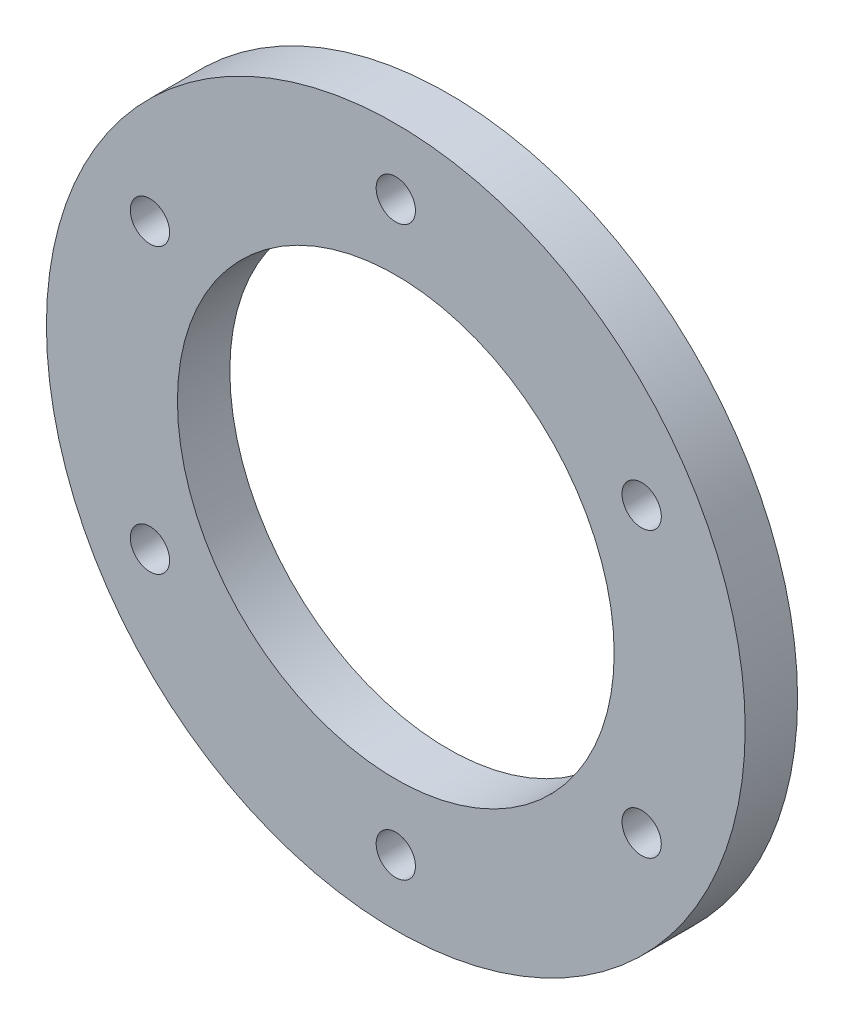
ISO-10303-21;
HEADER;
FILE_DESCRIPTION(('STEP AP214'),'2;1');
FILE_NAME('part.step','',(''),(''),'','','');
FILE_SCHEMA(('AUTOMOTIVE_DESIGN { 1 0 10303 214 1 1 1 1 }'));
ENDSEC;
DATA;
#1=APPLICATION_CONTEXT('core data for automotive mechanical design processes');
#2=APPLICATION_PROTOCOL_DEFINITION('international standard','automotive_design',2000,#1);
#3=PRODUCT_CONTEXT('',#1,'mechanical');
#4=PRODUCT('Part','Part','',(#3));
#5=PRODUCT_RELATED_PRODUCT_CATEGORY('part','',(#4));
#6=PRODUCT_DEFINITION_FORMATION('','',#4);
#7=PRODUCT_DEFINITION_CONTEXT('part definition',#1,'design');
#8=PRODUCT_DEFINITION('design','',#6,#7);
#9=PRODUCT_DEFINITION_SHAPE('','',#8);
#10=(LENGTH_UNIT() NAMED_UNIT(*) SI_UNIT(.MILLI.,.METRE.));
#11=(NAMED_UNIT(*) PLANE_ANGLE_UNIT() SI_UNIT($,.RADIAN.));
#12=(NAMED_UNIT(*) SI_UNIT($,.STERADIAN.) SOLID_ANGLE_UNIT());
#13=UNCERTAINTY_MEASURE_WITH_UNIT(LENGTH_MEASURE(1.E-05),#10,'distance_accuracy_value','');
#14=(GEOMETRIC_REPRESENTATION_CONTEXT(3) GLOBAL_UNCERTAINTY_ASSIGNED_CONTEXT((#13)) GLOBAL_UNIT_ASSIGNED_CONTEXT((#10,
#11,#12)) REPRESENTATION_CONTEXT('',''));
#15=CARTESIAN_POINT('',(0.,0.,0.));
#16=DIRECTION('',(0.,0.,1.));
#17=DIRECTION('',(1.,0.,0.));
#18=AXIS2_PLACEMENT_3D('',#15,#16,#17);
#19=CARTESIAN_POINT('',(0.,0.,6.));
#20=DIRECTION('',(0.,0.,1.));
#21=DIRECTION('',(1.,0.,0.));
#22=AXIS2_PLACEMENT_3D('',#19,#20,#21);
#23=PLANE('',#22);
#24=CARTESIAN_POINT('',(28.1458256229941,16.2500000000003,6.));
#25=DIRECTION('',(0.,0.,1.));
#26=DIRECTION('',(0.50000000000001,-0.866025403784433,0.));
#27=AXIS2_PLACEMENT_3D('',#24,#25,#26);
#28=CIRCLE('',#27,2.25);
#29=CARTESIAN_POINT('',(29.2708256229941,14.3014428414854,6.));
#30=VERTEX_POINT('',#29);
#31=EDGE_CURVE('E80',#30,#30,#28,.T.);
#32=ORIENTED_EDGE('',*,*,#31,.F.);
#33=EDGE_LOOP('',(#32));
#34=FACE_BOUND('',#33,.T.);
#35=CARTESIAN_POINT('',(28.1458256229944,-16.2499999999997,6.));
#36=DIRECTION('',(0.,0.,1.));
#37=DIRECTION('',(-0.499999999999992,-0.866025403784443,0.));
#38=AXIS2_PLACEMENT_3D('',#35,#36,#37);
#39=CIRCLE('',#38,2.25);
#40=CARTESIAN_POINT('',(27.0208256229944,-18.1985571585147,6.));
#41=VERTEX_POINT('',#40);
#42=EDGE_CURVE('E88',#41,#41,#39,.T.);
#43=ORIENTED_EDGE('',*,*,#42,.F.);
#44=EDGE_LOOP('',(#43));
#45=FACE_BOUND('',#44,.T.);
#46=CARTESIAN_POINT('',(0.,-32.5,6.));
#47=DIRECTION('',(0.,0.,1.));
#48=DIRECTION('',(-1.,0.,0.));
#49=AXIS2_PLACEMENT_3D('',#46,#47,#48);
#50=CIRCLE('',#49,2.25);
#51=CARTESIAN_POINT('',(-2.25,-32.5,6.));
#52=VERTEX_POINT('',#51);
#53=EDGE_CURVE('E96',#52,#52,#50,.T.);
#54=ORIENTED_EDGE('',*,*,#53,.F.);
#55=EDGE_LOOP('',(#54));
#56=FACE_BOUND('',#55,.T.);
#57=CARTESIAN_POINT('',(-28.1458256229942,-16.2500000000001,6.));
#58=DIRECTION('',(0.,0.,1.));
#59=DIRECTION('',(-0.500000000000004,0.866025403784436,0.));
#60=AXIS2_PLACEMENT_3D('',#57,#58,#59);
#61=CIRCLE('',#60,2.25);
#62=CARTESIAN_POINT('',(-29.2708256229942,-14.3014428414851,6.));
#63=VERTEX_POINT('',#62);
#64=EDGE_CURVE('E72',#63,#63,#61,.T.);
#65=ORIENTED_EDGE('',*,*,#64,.F.);
#66=EDGE_LOOP('',(#65));
#67=FACE_BOUND('',#66,.T.);
#68=CARTESIAN_POINT('',(-28.1458256229943,16.2499999999999,6.));
#69=DIRECTION('',(0.,0.,1.));
#70=DIRECTION('',(0.499999999999998,0.86602540378444,0.));
#71=AXIS2_PLACEMENT_3D('',#68,#69,#70);
#72=CIRCLE('',#71,2.25);
#73=CARTESIAN_POINT('',(-27.0208256229943,18.1985571585149,6.));
#74=VERTEX_POINT('',#73);
#75=EDGE_CURVE('E64',#74,#74,#72,.T.);
#76=ORIENTED_EDGE('',*,*,#75,.F.);
#77=EDGE_LOOP('',(#76));
#78=FACE_BOUND('',#77,.T.);
#79=CARTESIAN_POINT('',(0.,32.5,6.));
#80=DIRECTION('',(0.,0.,1.));
#81=DIRECTION('',(1.,0.,0.));
#82=AXIS2_PLACEMENT_3D('',#79,#80,#81);
#83=CIRCLE('',#82,2.25);
#84=CARTESIAN_POINT('',(2.25,32.5,6.));
#85=VERTEX_POINT('',#84);
#86=EDGE_CURVE('E56',#85,#85,#83,.T.);
#87=ORIENTED_EDGE('',*,*,#86,.F.);
#88=EDGE_LOOP('',(#87));
#89=FACE_BOUND('',#88,.T.);
#90=CARTESIAN_POINT('',(0.,0.,6.));
#91=DIRECTION('',(0.,0.,1.));
#92=DIRECTION('',(1.,0.,0.));
#93=AXIS2_PLACEMENT_3D('',#90,#91,#92);
#94=CIRCLE('',#93,40.);
#95=CARTESIAN_POINT('',(40.,0.,6.));
#96=VERTEX_POINT('',#95);
#97=EDGE_CURVE('E10',#96,#96,#94,.T.);
#98=ORIENTED_EDGE('',*,*,#97,.T.);
#99=EDGE_LOOP('',(#98));
#100=FACE_BOUND('',#99,.T.);
#101=CARTESIAN_POINT('',(0.,0.,6.));
#102=DIRECTION('',(0.,0.,1.));
#103=DIRECTION('',(1.,0.,0.));
#104=AXIS2_PLACEMENT_3D('',#101,#102,#103);
#105=CIRCLE('',#104,25.);
#106=CARTESIAN_POINT('',(25.,0.,6.));
#107=VERTEX_POINT('',#106);
#108=EDGE_CURVE('E50',#107,#107,#105,.T.);
#109=ORIENTED_EDGE('',*,*,#108,.F.);
#110=EDGE_LOOP('',(#109));
#111=FACE_BOUND('',#110,.T.);
#112=ADVANCED_FACE('F37',(#34,#45,#56,#67,#78,#89,#100,#111),#23,.T.);
#113=CARTESIAN_POINT('',(0.,0.,0.));
#114=DIRECTION('',(0.,0.,1.));
#115=DIRECTION('',(1.,0.,0.));
#116=AXIS2_PLACEMENT_3D('',#113,#114,#115);
#117=PLANE('',#116);
#118=CARTESIAN_POINT('',(28.1458256229941,16.2500000000003,0.));
#119=DIRECTION('',(0.,0.,1.));
#120=DIRECTION('',(0.50000000000001,-0.866025403784433,0.));
#121=AXIS2_PLACEMENT_3D('',#118,#119,#120);
#122=CIRCLE('',#121,2.25);
#123=CARTESIAN_POINT('',(29.2708256229941,14.3014428414854,0.));
#124=VERTEX_POINT('',#123);
#125=EDGE_CURVE('E76',#124,#124,#122,.T.);
#126=ORIENTED_EDGE('',*,*,#125,.T.);
#127=EDGE_LOOP('',(#126));
#128=FACE_BOUND('',#127,.T.);
#129=CARTESIAN_POINT('',(28.1458256229944,-16.2499999999997,0.));
#130=DIRECTION('',(0.,0.,1.));
#131=DIRECTION('',(-0.499999999999992,-0.866025403784443,0.));
#132=AXIS2_PLACEMENT_3D('',#129,#130,#131);
#133=CIRCLE('',#132,2.25);
#134=CARTESIAN_POINT('',(27.0208256229944,-18.1985571585147,0.));
#135=VERTEX_POINT('',#134);
#136=EDGE_CURVE('E84',#135,#135,#133,.T.);
#137=ORIENTED_EDGE('',*,*,#136,.T.);
#138=EDGE_LOOP('',(#137));
#139=FACE_BOUND('',#138,.T.);
#140=CARTESIAN_POINT('',(0.,-32.5,0.));
#141=DIRECTION('',(0.,0.,1.));
#142=DIRECTION('',(-1.,0.,0.));
#143=AXIS2_PLACEMENT_3D('',#140,#141,#142);
#144=CIRCLE('',#143,2.25);
#145=CARTESIAN_POINT('',(-2.25,-32.5,0.));
#146=VERTEX_POINT('',#145);
#147=EDGE_CURVE('E92',#146,#146,#144,.T.);
#148=ORIENTED_EDGE('',*,*,#147,.T.);
#149=EDGE_LOOP('',(#148));
#150=FACE_BOUND('',#149,.T.);
#151=CARTESIAN_POINT('',(-28.1458256229942,-16.2500000000001,0.));
#152=DIRECTION('',(0.,0.,1.));
#153=DIRECTION('',(-0.500000000000004,0.866025403784436,0.));
#154=AXIS2_PLACEMENT_3D('',#151,#152,#153);
#155=CIRCLE('',#154,2.25);
#156=CARTESIAN_POINT('',(-29.2708256229942,-14.3014428414851,0.));
#157=VERTEX_POINT('',#156);
#158=EDGE_CURVE('E100',#157,#157,#155,.T.);
#159=ORIENTED_EDGE('',*,*,#158,.T.);
#160=EDGE_LOOP('',(#159));
#161=FACE_BOUND('',#160,.T.);
#162=CARTESIAN_POINT('',(-28.1458256229943,16.2499999999999,0.));
#163=DIRECTION('',(0.,0.,1.));
#164=DIRECTION('',(0.499999999999998,0.86602540378444,0.));
#165=AXIS2_PLACEMENT_3D('',#162,#163,#164);
#166=CIRCLE('',#165,2.25);
#167=CARTESIAN_POINT('',(-27.0208256229943,18.1985571585149,0.));
#168=VERTEX_POINT('',#167);
#169=EDGE_CURVE('E68',#168,#168,#166,.T.);
#170=ORIENTED_EDGE('',*,*,#169,.T.);
#171=EDGE_LOOP('',(#170));
#172=FACE_BOUND('',#171,.T.);
#173=CARTESIAN_POINT('',(0.,32.5,0.));
#174=DIRECTION('',(0.,0.,1.));
#175=DIRECTION('',(1.,0.,0.));
#176=AXIS2_PLACEMENT_3D('',#173,#174,#175);
#177=CIRCLE('',#176,2.25);
#178=CARTESIAN_POINT('',(2.25,32.5,0.));
#179=VERTEX_POINT('',#178);
#180=EDGE_CURVE('E60',#179,#179,#177,.T.);
#181=ORIENTED_EDGE('',*,*,#180,.T.);
#182=EDGE_LOOP('',(#181));
#183=FACE_BOUND('',#182,.T.);
#184=CARTESIAN_POINT('',(0.,0.,0.));
#185=DIRECTION('',(0.,0.,1.));
#186=DIRECTION('',(1.,0.,0.));
#187=AXIS2_PLACEMENT_3D('',#184,#185,#186);
#188=CIRCLE('',#187,40.);
#189=CARTESIAN_POINT('',(40.,0.,0.));
#190=VERTEX_POINT('',#189);
#191=EDGE_CURVE('E41',#190,#190,#188,.T.);
#192=ORIENTED_EDGE('',*,*,#191,.F.);
#193=EDGE_LOOP('',(#192));
#194=FACE_BOUND('',#193,.T.);
#195=CARTESIAN_POINT('',(0.,0.,0.));
#196=DIRECTION('',(0.,0.,1.));
#197=DIRECTION('',(1.,0.,0.));
#198=AXIS2_PLACEMENT_3D('',#195,#196,#197);
#199=CIRCLE('',#198,25.);
#200=CARTESIAN_POINT('',(25.,0.,0.));
#201=VERTEX_POINT('',#200);
#202=EDGE_CURVE('E52',#201,#201,#199,.T.);
#203=ORIENTED_EDGE('',*,*,#202,.T.);
#204=EDGE_LOOP('',(#203));
#205=FACE_BOUND('',#204,.T.);
#206=ADVANCED_FACE('F113',(#128,#139,#150,#161,#172,#183,#194,#205),#117,.F.);
#207=CARTESIAN_POINT('',(0.,0.,6.));
#208=DIRECTION('',(0.,0.,-1.));
#209=DIRECTION('',(-1.,0.,0.));
#210=AXIS2_PLACEMENT_3D('',#207,#208,#209);
#211=CYLINDRICAL_SURFACE('',#210,40.);
#212=ORIENTED_EDGE('',*,*,#97,.F.);
#213=EDGE_LOOP('',(#212));
#214=FACE_BOUND('',#213,.T.);
#215=ORIENTED_EDGE('',*,*,#191,.T.);
#216=EDGE_LOOP('',(#215));
#217=FACE_BOUND('',#216,.T.);
#218=ADVANCED_FACE('F39',(#214,#217),#211,.T.);
#219=CARTESIAN_POINT('',(0.,0.,6.));
#220=DIRECTION('',(0.,0.,-1.));
#221=DIRECTION('',(-1.,0.,0.));
#222=AXIS2_PLACEMENT_3D('',#219,#220,#221);
#223=CYLINDRICAL_SURFACE('',#222,25.);
#224=ORIENTED_EDGE('',*,*,#108,.T.);
#225=EDGE_LOOP('',(#224));
#226=FACE_BOUND('',#225,.T.);
#227=ORIENTED_EDGE('',*,*,#202,.F.);
#228=EDGE_LOOP('',(#227));
#229=FACE_BOUND('',#228,.T.);
#230=ADVANCED_FACE('F122',(#226,#229),#223,.F.);
#231=CARTESIAN_POINT('',(0.,32.5,6.));
#232=DIRECTION('',(0.,0.,-1.));
#233=DIRECTION('',(-1.,0.,0.));
#234=AXIS2_PLACEMENT_3D('',#231,#232,#233);
#235=CYLINDRICAL_SURFACE('',#234,2.25);
#236=ORIENTED_EDGE('',*,*,#86,.T.);
#237=EDGE_LOOP('',(#236));
#238=FACE_BOUND('',#237,.T.);
#239=ORIENTED_EDGE('',*,*,#180,.F.);
#240=EDGE_LOOP('',(#239));
#241=FACE_BOUND('',#240,.T.);
#242=ADVANCED_FACE('F125',(#238,#241),#235,.F.);
#243=CARTESIAN_POINT('',(-28.1458256229943,16.2499999999999,6.));
#244=DIRECTION('',(0.,0.,-1.));
#245=DIRECTION('',(-1.,0.,0.));
#246=AXIS2_PLACEMENT_3D('',#243,#244,#245);
#247=CYLINDRICAL_SURFACE('',#246,2.25);
#248=ORIENTED_EDGE('',*,*,#75,.T.);
#249=EDGE_LOOP('',(#248));
#250=FACE_BOUND('',#249,.T.);
#251=ORIENTED_EDGE('',*,*,#169,.F.);
#252=EDGE_LOOP('',(#251));
#253=FACE_BOUND('',#252,.T.);
#254=ADVANCED_FACE('F139',(#250,#253),#247,.F.);
#255=CARTESIAN_POINT('',(-28.1458256229942,-16.2500000000001,6.));
#256=DIRECTION('',(0.,0.,-1.));
#257=DIRECTION('',(-1.,0.,0.));
#258=AXIS2_PLACEMENT_3D('',#255,#256,#257);
#259=CYLINDRICAL_SURFACE('',#258,2.25);
#260=ORIENTED_EDGE('',*,*,#64,.T.);
#261=EDGE_LOOP('',(#260));
#262=FACE_BOUND('',#261,.T.);
#263=ORIENTED_EDGE('',*,*,#158,.F.);
#264=EDGE_LOOP('',(#263));
#265=FACE_BOUND('',#264,.T.);
#266=ADVANCED_FACE('F108',(#262,#265),#259,.F.);
#267=CARTESIAN_POINT('',(0.,-32.5,6.));
#268=DIRECTION('',(0.,0.,-1.));
#269=DIRECTION('',(-1.,0.,0.));
#270=AXIS2_PLACEMENT_3D('',#267,#268,#269);
#271=CYLINDRICAL_SURFACE('',#270,2.25);
#272=ORIENTED_EDGE('',*,*,#53,.T.);
#273=EDGE_LOOP('',(#272));
#274=FACE_BOUND('',#273,.T.);
#275=ORIENTED_EDGE('',*,*,#147,.F.);
#276=EDGE_LOOP('',(#275));
#277=FACE_BOUND('',#276,.T.);
#278=ADVANCED_FACE('F151',(#274,#277),#271,.F.);
#279=CARTESIAN_POINT('',(28.1458256229944,-16.2499999999997,6.));
#280=DIRECTION('',(0.,0.,-1.));
#281=DIRECTION('',(-1.,0.,0.));
#282=AXIS2_PLACEMENT_3D('',#279,#280,#281);
#283=CYLINDRICAL_SURFACE('',#282,2.25);
#284=ORIENTED_EDGE('',*,*,#42,.T.);
#285=EDGE_LOOP('',(#284));
#286=FACE_BOUND('',#285,.T.);
#287=ORIENTED_EDGE('',*,*,#136,.F.);
#288=EDGE_LOOP('',(#287));
#289=FACE_BOUND('',#288,.T.);
#290=ADVANCED_FACE('F147',(#286,#289),#283,.F.);
#291=CARTESIAN_POINT('',(28.1458256229941,16.2500000000003,6.));
#292=DIRECTION('',(0.,0.,-1.));
#293=DIRECTION('',(-1.,0.,0.));
#294=AXIS2_PLACEMENT_3D('',#291,#292,#293);
#295=CYLINDRICAL_SURFACE('',#294,2.25);
#296=ORIENTED_EDGE('',*,*,#31,.T.);
#297=EDGE_LOOP('',(#296));
#298=FACE_BOUND('',#297,.T.);
#299=ORIENTED_EDGE('',*,*,#125,.F.);
#300=EDGE_LOOP('',(#299));
#301=FACE_BOUND('',#300,.T.);
#302=ADVANCED_FACE('F144',(#298,#301),#295,.F.);
#303=CLOSED_SHELL('',(#112,#206,#218,#230,#242,#254,#266,#278,#290,#302));
#304=MANIFOLD_SOLID_BREP('B2',#303);
#305=ADVANCED_BREP_SHAPE_REPRESENTATION('',(#18,#304),#14);
#306=SHAPE_DEFINITION_REPRESENTATION(#9,#305);
ENDSEC;
END-ISO-10303-21;
